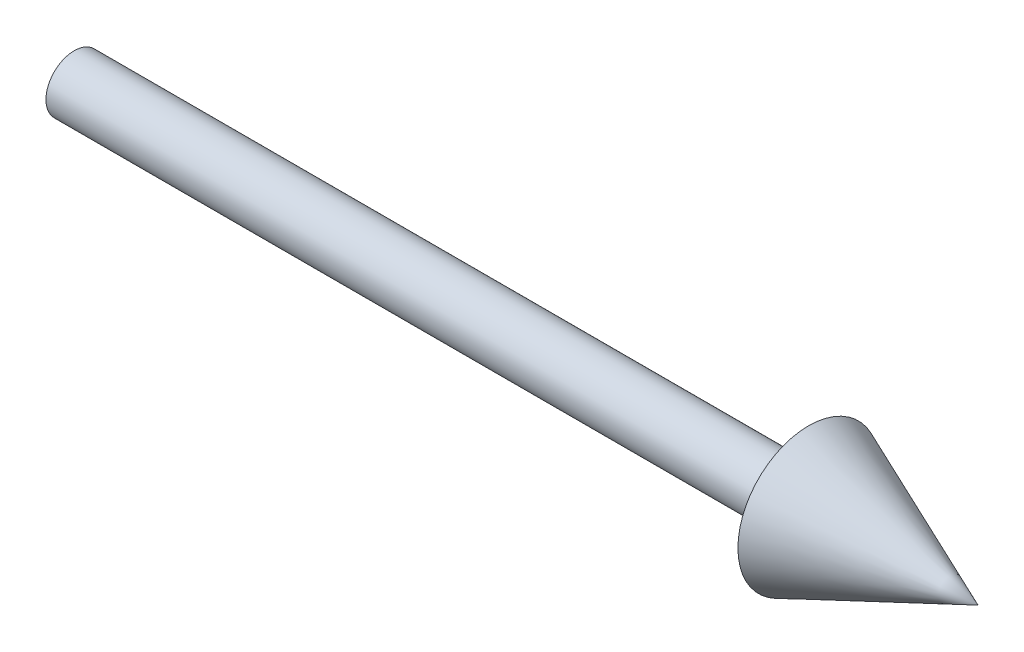
ISO-10303-21;
HEADER;
FILE_DESCRIPTION(('STEP AP214'),'2;1');
FILE_NAME('part.step','',(''),(''),'','','');
FILE_SCHEMA(('AUTOMOTIVE_DESIGN { 1 0 10303 214 1 1 1 1 }'));
ENDSEC;
DATA;
#1=APPLICATION_CONTEXT('core data for automotive mechanical design processes');
#2=APPLICATION_PROTOCOL_DEFINITION('international standard','automotive_design',2000,#1);
#3=PRODUCT_CONTEXT('',#1,'mechanical');
#4=PRODUCT('Part','Part','',(#3));
#5=PRODUCT_RELATED_PRODUCT_CATEGORY('part','',(#4));
#6=PRODUCT_DEFINITION_FORMATION('','',#4);
#7=PRODUCT_DEFINITION_CONTEXT('part definition',#1,'design');
#8=PRODUCT_DEFINITION('design','',#6,#7);
#9=PRODUCT_DEFINITION_SHAPE('','',#8);
#10=(LENGTH_UNIT() NAMED_UNIT(*) SI_UNIT(.MILLI.,.METRE.));
#11=(NAMED_UNIT(*) PLANE_ANGLE_UNIT() SI_UNIT($,.RADIAN.));
#12=(NAMED_UNIT(*) SI_UNIT($,.STERADIAN.) SOLID_ANGLE_UNIT());
#13=UNCERTAINTY_MEASURE_WITH_UNIT(LENGTH_MEASURE(1.E-05),#10,'distance_accuracy_value','');
#14=(GEOMETRIC_REPRESENTATION_CONTEXT(3) GLOBAL_UNCERTAINTY_ASSIGNED_CONTEXT((#13)) GLOBAL_UNIT_ASSIGNED_CONTEXT((#10,
#11,#12)) REPRESENTATION_CONTEXT('',''));
#15=CARTESIAN_POINT('',(0.,0.,0.));
#16=DIRECTION('',(0.,0.,1.));
#17=DIRECTION('',(1.,0.,0.));
#18=AXIS2_PLACEMENT_3D('',#15,#16,#17);
#19=CARTESIAN_POINT('',(0.,0.,0.));
#20=DIRECTION('',(-1.,0.,0.));
#21=DIRECTION('',(0.,0.,1.));
#22=AXIS2_PLACEMENT_3D('',#19,#20,#21);
#23=PLANE('',#22);
#24=CARTESIAN_POINT('',(0.,0.,0.));
#25=DIRECTION('',(1.,0.,0.));
#26=DIRECTION('',(0.,0.,-1.));
#27=AXIS2_PLACEMENT_3D('',#24,#25,#26);
#28=CIRCLE('',#27,5.);
#29=CARTESIAN_POINT('',(0.,0.,-5.));
#30=VERTEX_POINT('',#29);
#31=EDGE_CURVE('E11',#30,#30,#28,.T.);
#32=ORIENTED_EDGE('',*,*,#31,.F.);
#33=EDGE_LOOP('',(#32));
#34=FACE_BOUND('',#33,.T.);
#35=ADVANCED_FACE('F39',(#34),#23,.T.);
#36=CARTESIAN_POINT('',(0.,0.,0.));
#37=DIRECTION('',(1.,0.,0.));
#38=DIRECTION('',(0.,0.,-1.));
#39=AXIS2_PLACEMENT_3D('',#36,#37,#38);
#40=CYLINDRICAL_SURFACE('',#39,5.);
#41=ORIENTED_EDGE('',*,*,#31,.T.);
#42=EDGE_LOOP('',(#41));
#43=FACE_BOUND('',#42,.T.);
#44=CARTESIAN_POINT('',(130.,0.,0.));
#45=DIRECTION('',(1.,0.,0.));
#46=DIRECTION('',(0.,0.,-1.));
#47=AXIS2_PLACEMENT_3D('',#44,#45,#46);
#48=CIRCLE('',#47,5.);
#49=CARTESIAN_POINT('',(130.,0.,-5.));
#50=VERTEX_POINT('',#49);
#51=EDGE_CURVE('E46',#50,#50,#48,.T.);
#52=ORIENTED_EDGE('',*,*,#51,.F.);
#53=EDGE_LOOP('',(#52));
#54=FACE_BOUND('',#53,.T.);
#55=ADVANCED_FACE('F57',(#43,#54),#40,.T.);
#56=CARTESIAN_POINT('',(130.,5.,0.));
#57=DIRECTION('',(-1.,0.,0.));
#58=DIRECTION('',(0.,0.,1.));
#59=AXIS2_PLACEMENT_3D('',#56,#57,#58);
#60=PLANE('',#59);
#61=ORIENTED_EDGE('',*,*,#51,.T.);
#62=EDGE_LOOP('',(#61));
#63=FACE_BOUND('',#62,.T.);
#64=CARTESIAN_POINT('',(130.,0.,0.));
#65=DIRECTION('',(1.,0.,0.));
#66=DIRECTION('',(0.,0.,-1.));
#67=AXIS2_PLACEMENT_3D('',#64,#65,#66);
#68=CIRCLE('',#67,12.5);
#69=CARTESIAN_POINT('',(130.,0.,-12.5));
#70=VERTEX_POINT('',#69);
#71=EDGE_CURVE('E72',#70,#70,#68,.T.);
#72=ORIENTED_EDGE('',*,*,#71,.F.);
#73=EDGE_LOOP('',(#72));
#74=FACE_BOUND('',#73,.T.);
#75=ADVANCED_FACE('F51',(#63,#74),#60,.T.);
#76=CARTESIAN_POINT('',(160.,0.,0.));
#77=DIRECTION('',(-1.,0.,0.));
#78=DIRECTION('',(0.,0.,1.));
#79=AXIS2_PLACEMENT_3D('',#76,#77,#78);
#80=CONICAL_SURFACE('',#79,0.,0.394791119699762);
#81=ORIENTED_EDGE('',*,*,#71,.T.);
#82=EDGE_LOOP('',(#81));
#83=FACE_BOUND('',#82,.T.);
#84=CARTESIAN_POINT('',(160.,0.,0.));
#85=VERTEX_POINT('',#84);
#86=VERTEX_LOOP('',#85);
#87=FACE_BOUND('',#86,.T.);
#88=ADVANCED_FACE('F49',(#83,#87),#80,.T.);
#89=CLOSED_SHELL('',(#35,#55,#75,#88));
#90=MANIFOLD_SOLID_BREP('B2',#89);
#91=ADVANCED_BREP_SHAPE_REPRESENTATION('',(#18,#90),#14);
#92=SHAPE_DEFINITION_REPRESENTATION(#9,#91);
ENDSEC;
END-ISO-10303-21;
